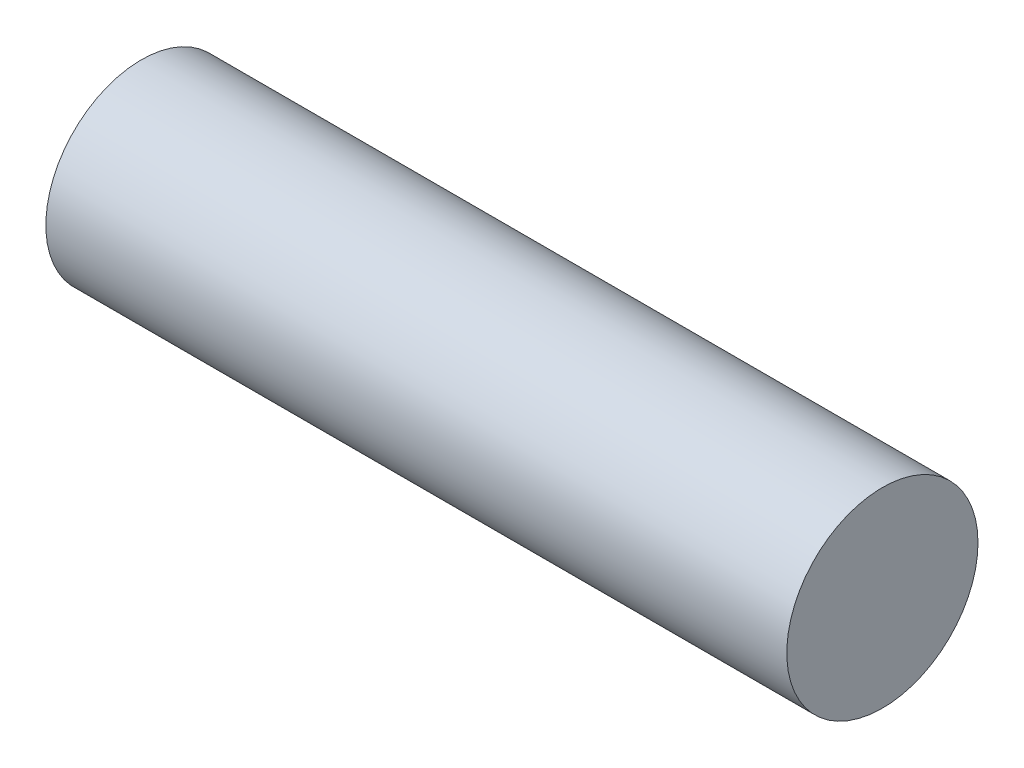
ISO-10303-21;
HEADER;
FILE_DESCRIPTION(('STEP AP214'),'2;1');
FILE_NAME('part.step','',(''),(''),'','','');
FILE_SCHEMA(('AUTOMOTIVE_DESIGN { 1 0 10303 214 1 1 1 1 }'));
ENDSEC;
DATA;
#1=APPLICATION_CONTEXT('core data for automotive mechanical design processes');
#2=APPLICATION_PROTOCOL_DEFINITION('international standard','automotive_design',2000,#1);
#3=PRODUCT_CONTEXT('',#1,'mechanical');
#4=PRODUCT('Part','Part','',(#3));
#5=PRODUCT_RELATED_PRODUCT_CATEGORY('part','',(#4));
#6=PRODUCT_DEFINITION_FORMATION('','',#4);
#7=PRODUCT_DEFINITION_CONTEXT('part definition',#1,'design');
#8=PRODUCT_DEFINITION('design','',#6,#7);
#9=PRODUCT_DEFINITION_SHAPE('','',#8);
#10=(LENGTH_UNIT() NAMED_UNIT(*) SI_UNIT(.MILLI.,.METRE.));
#11=(NAMED_UNIT(*) PLANE_ANGLE_UNIT() SI_UNIT($,.RADIAN.));
#12=(NAMED_UNIT(*) SI_UNIT($,.STERADIAN.) SOLID_ANGLE_UNIT());
#13=UNCERTAINTY_MEASURE_WITH_UNIT(LENGTH_MEASURE(1.E-05),#10,'distance_accuracy_value','');
#14=(GEOMETRIC_REPRESENTATION_CONTEXT(3) GLOBAL_UNCERTAINTY_ASSIGNED_CONTEXT((#13)) GLOBAL_UNIT_ASSIGNED_CONTEXT((#10,
#11,#12)) REPRESENTATION_CONTEXT('',''));
#15=CARTESIAN_POINT('',(0.,0.,0.));
#16=DIRECTION('',(0.,0.,1.));
#17=DIRECTION('',(1.,0.,0.));
#18=AXIS2_PLACEMENT_3D('',#15,#16,#17);
#19=CARTESIAN_POINT('',(15.5,0.,0.));
#20=DIRECTION('',(-1.,0.,0.));
#21=DIRECTION('',(0.,0.,1.));
#22=AXIS2_PLACEMENT_3D('',#19,#20,#21);
#23=CYLINDRICAL_SURFACE('',#22,2.);
#24=CARTESIAN_POINT('',(15.5,0.,0.));
#25=DIRECTION('',(1.,0.,0.));
#26=DIRECTION('',(0.,0.,-1.));
#27=AXIS2_PLACEMENT_3D('',#24,#25,#26);
#28=CIRCLE('',#27,2.);
#29=CARTESIAN_POINT('',(15.5,0.,-2.));
#30=VERTEX_POINT('',#29);
#31=EDGE_CURVE('E10',#30,#30,#28,.T.);
#32=ORIENTED_EDGE('',*,*,#31,.F.);
#33=EDGE_LOOP('',(#32));
#34=FACE_BOUND('',#33,.T.);
#35=CARTESIAN_POINT('',(0.,0.,0.));
#36=DIRECTION('',(1.,0.,0.));
#37=DIRECTION('',(0.,0.,-1.));
#38=AXIS2_PLACEMENT_3D('',#35,#36,#37);
#39=CIRCLE('',#38,2.);
#40=CARTESIAN_POINT('',(0.,0.,-2.));
#41=VERTEX_POINT('',#40);
#42=EDGE_CURVE('E33',#41,#41,#39,.T.);
#43=ORIENTED_EDGE('',*,*,#42,.T.);
#44=EDGE_LOOP('',(#43));
#45=FACE_BOUND('',#44,.T.);
#46=ADVANCED_FACE('F30',(#34,#45),#23,.T.);
#47=CARTESIAN_POINT('',(15.5,0.,0.));
#48=DIRECTION('',(1.,0.,0.));
#49=DIRECTION('',(0.,0.,-1.));
#50=AXIS2_PLACEMENT_3D('',#47,#48,#49);
#51=PLANE('',#50);
#52=ORIENTED_EDGE('',*,*,#31,.T.);
#53=EDGE_LOOP('',(#52));
#54=FACE_BOUND('',#53,.T.);
#55=ADVANCED_FACE('F45',(#54),#51,.T.);
#56=CARTESIAN_POINT('',(0.,0.,0.));
#57=DIRECTION('',(1.,0.,0.));
#58=DIRECTION('',(0.,0.,-1.));
#59=AXIS2_PLACEMENT_3D('',#56,#57,#58);
#60=PLANE('',#59);
#61=ORIENTED_EDGE('',*,*,#42,.F.);
#62=EDGE_LOOP('',(#61));
#63=FACE_BOUND('',#62,.T.);
#64=ADVANCED_FACE('F43',(#63),#60,.F.);
#65=CLOSED_SHELL('',(#46,#55,#64));
#66=MANIFOLD_SOLID_BREP('B2',#65);
#67=ADVANCED_BREP_SHAPE_REPRESENTATION('',(#18,#66),#14);
#68=SHAPE_DEFINITION_REPRESENTATION(#9,#67);
ENDSEC;
END-ISO-10303-21;
